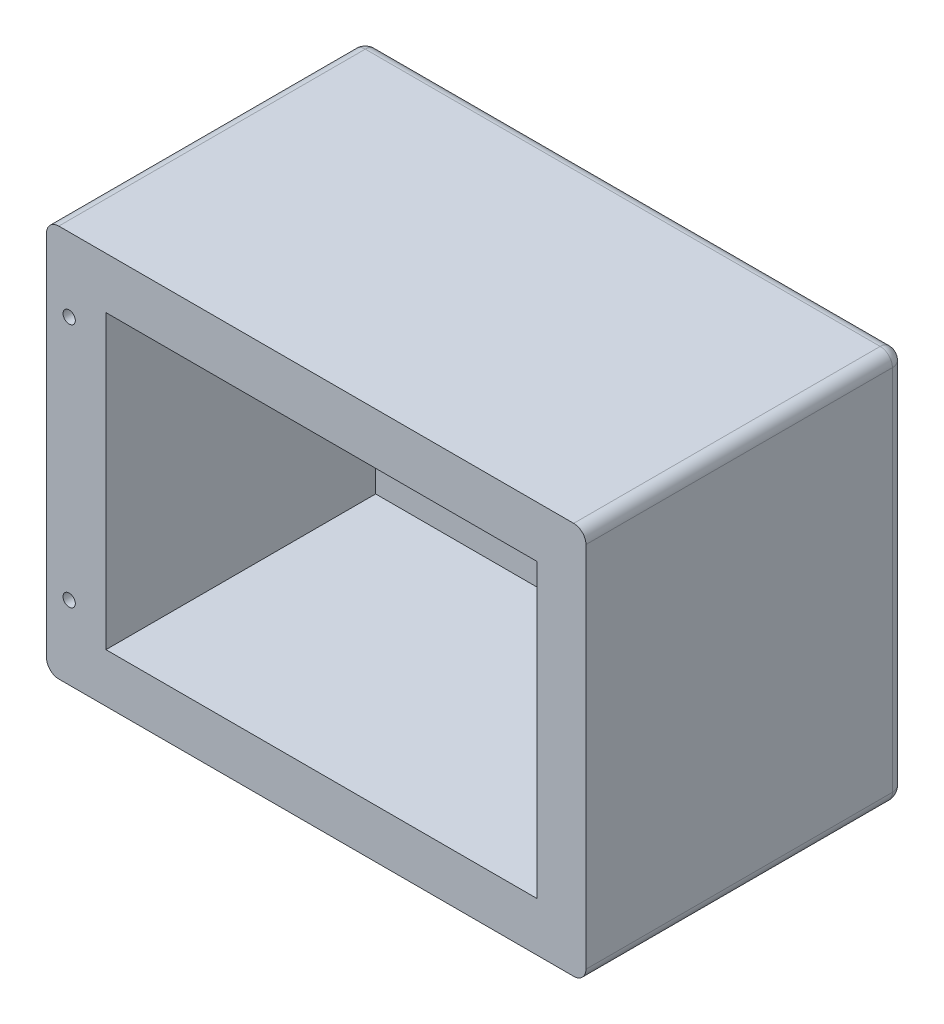
ISO-10303-21;
HEADER;
FILE_DESCRIPTION(('STEP AP214'),'2;1');
FILE_NAME('part.step','',(''),(''),'','','');
FILE_SCHEMA(('AUTOMOTIVE_DESIGN { 1 0 10303 214 1 1 1 1 }'));
ENDSEC;
DATA;
#1=APPLICATION_CONTEXT('core data for automotive mechanical design processes');
#2=APPLICATION_PROTOCOL_DEFINITION('international standard','automotive_design',2000,#1);
#3=PRODUCT_CONTEXT('',#1,'mechanical');
#4=PRODUCT('Part','Part','',(#3));
#5=PRODUCT_RELATED_PRODUCT_CATEGORY('part','',(#4));
#6=PRODUCT_DEFINITION_FORMATION('','',#4);
#7=PRODUCT_DEFINITION_CONTEXT('part definition',#1,'design');
#8=PRODUCT_DEFINITION('design','',#6,#7);
#9=PRODUCT_DEFINITION_SHAPE('','',#8);
#10=(LENGTH_UNIT() NAMED_UNIT(*) SI_UNIT(.MILLI.,.METRE.));
#11=(NAMED_UNIT(*) PLANE_ANGLE_UNIT() SI_UNIT($,.RADIAN.));
#12=(NAMED_UNIT(*) SI_UNIT($,.STERADIAN.) SOLID_ANGLE_UNIT());
#13=UNCERTAINTY_MEASURE_WITH_UNIT(LENGTH_MEASURE(1.E-05),#10,'distance_accuracy_value','');
#14=(GEOMETRIC_REPRESENTATION_CONTEXT(3) GLOBAL_UNCERTAINTY_ASSIGNED_CONTEXT((#13)) GLOBAL_UNIT_ASSIGNED_CONTEXT((#10,
#11,#12)) REPRESENTATION_CONTEXT('',''));
#15=CARTESIAN_POINT('',(0.,0.,0.));
#16=DIRECTION('',(0.,0.,1.));
#17=DIRECTION('',(1.,0.,0.));
#18=AXIS2_PLACEMENT_3D('',#15,#16,#17);
#19=CARTESIAN_POINT('',(0.,-320.,260.));
#20=DIRECTION('',(1.,0.,0.));
#21=DIRECTION('',(0.,1.,0.));
#22=AXIS2_PLACEMENT_3D('',#19,#20,#21);
#23=PLANE('',#22);
#24=DIRECTION('',(0.,-1.,0.));
#25=VECTOR('',#24,1.);
#26=CARTESIAN_POINT('',(0.,-320.,260.));
#27=LINE('',#26,#25);
#28=CARTESIAN_POINT('',(0.,-10.,260.));
#29=VERTEX_POINT('',#28);
#30=CARTESIAN_POINT('',(0.,-310.,260.));
#31=VERTEX_POINT('',#30);
#32=EDGE_CURVE('E196',#29,#31,#27,.T.);
#33=ORIENTED_EDGE('',*,*,#32,.F.);
#34=DIRECTION('',(0.,0.,-1.));
#35=VECTOR('',#34,1.);
#36=CARTESIAN_POINT('',(0.,-10.,260.));
#37=LINE('',#36,#35);
#38=CARTESIAN_POINT('',(0.,-10.,10.));
#39=VERTEX_POINT('',#38);
#40=EDGE_CURVE('E255',#29,#39,#37,.T.);
#41=ORIENTED_EDGE('',*,*,#40,.T.);
#42=DIRECTION('',(0.,-1.,0.));
#43=VECTOR('',#42,1.);
#44=CARTESIAN_POINT('',(0.,-320.,10.));
#45=LINE('',#44,#43);
#46=CARTESIAN_POINT('',(0.,-310.,10.));
#47=VERTEX_POINT('',#46);
#48=EDGE_CURVE('E252',#39,#47,#45,.T.);
#49=ORIENTED_EDGE('',*,*,#48,.T.);
#50=DIRECTION('',(0.,0.,-1.));
#51=VECTOR('',#50,1.);
#52=CARTESIAN_POINT('',(0.,-310.,260.));
#53=LINE('',#52,#51);
#54=EDGE_CURVE('E249',#47,#31,#53,.F.);
#55=ORIENTED_EDGE('',*,*,#54,.T.);
#56=EDGE_LOOP('',(#33,#41,#49,#55));
#57=FACE_BOUND('',#56,.T.);
#58=ADVANCED_FACE('F44',(#57),#23,.F.);
#59=CARTESIAN_POINT('',(440.,-320.,260.));
#60=DIRECTION('',(0.,1.,0.));
#61=DIRECTION('',(-1.,0.,0.));
#62=AXIS2_PLACEMENT_3D('',#59,#60,#61);
#63=PLANE('',#62);
#64=DIRECTION('',(1.,0.,0.));
#65=VECTOR('',#64,1.);
#66=CARTESIAN_POINT('',(440.,-320.,260.));
#67=LINE('',#66,#65);
#68=CARTESIAN_POINT('',(10.,-320.,260.));
#69=VERTEX_POINT('',#68);
#70=CARTESIAN_POINT('',(430.,-320.,260.));
#71=VERTEX_POINT('',#70);
#72=EDGE_CURVE('E205',#69,#71,#67,.T.);
#73=ORIENTED_EDGE('',*,*,#72,.F.);
#74=DIRECTION('',(0.,0.,-1.));
#75=VECTOR('',#74,1.);
#76=CARTESIAN_POINT('',(10.,-320.,260.));
#77=LINE('',#76,#75);
#78=CARTESIAN_POINT('',(10.,-320.,10.));
#79=VERTEX_POINT('',#78);
#80=EDGE_CURVE('E224',#69,#79,#77,.T.);
#81=ORIENTED_EDGE('',*,*,#80,.T.);
#82=DIRECTION('',(1.,0.,0.));
#83=VECTOR('',#82,1.);
#84=CARTESIAN_POINT('',(440.,-320.,10.));
#85=LINE('',#84,#83);
#86=CARTESIAN_POINT('',(430.,-320.,10.));
#87=VERTEX_POINT('',#86);
#88=EDGE_CURVE('E220',#79,#87,#85,.T.);
#89=ORIENTED_EDGE('',*,*,#88,.T.);
#90=DIRECTION('',(0.,0.,-1.));
#91=VECTOR('',#90,1.);
#92=CARTESIAN_POINT('',(430.,-320.,260.));
#93=LINE('',#92,#91);
#94=EDGE_CURVE('E217',#87,#71,#93,.F.);
#95=ORIENTED_EDGE('',*,*,#94,.T.);
#96=EDGE_LOOP('',(#73,#81,#89,#95));
#97=FACE_BOUND('',#96,.T.);
#98=ADVANCED_FACE('F346',(#97),#63,.F.);
#99=CARTESIAN_POINT('',(440.,0.,260.));
#100=DIRECTION('',(-1.,0.,0.));
#101=DIRECTION('',(0.,0.,1.));
#102=AXIS2_PLACEMENT_3D('',#99,#100,#101);
#103=PLANE('',#102);
#104=DIRECTION('',(0.,1.,0.));
#105=VECTOR('',#104,1.);
#106=CARTESIAN_POINT('',(440.,0.,260.));
#107=LINE('',#106,#105);
#108=CARTESIAN_POINT('',(440.,-310.,260.));
#109=VERTEX_POINT('',#108);
#110=CARTESIAN_POINT('',(440.,-10.,260.));
#111=VERTEX_POINT('',#110);
#112=EDGE_CURVE('E209',#109,#111,#107,.T.);
#113=ORIENTED_EDGE('',*,*,#112,.F.);
#114=DIRECTION('',(0.,0.,-1.));
#115=VECTOR('',#114,1.);
#116=CARTESIAN_POINT('',(440.,-310.,260.));
#117=LINE('',#116,#115);
#118=CARTESIAN_POINT('',(440.,-310.,10.));
#119=VERTEX_POINT('',#118);
#120=EDGE_CURVE('E11',#109,#119,#117,.T.);
#121=ORIENTED_EDGE('',*,*,#120,.T.);
#122=DIRECTION('',(0.,1.,0.));
#123=VECTOR('',#122,1.);
#124=CARTESIAN_POINT('',(440.,0.,10.));
#125=LINE('',#124,#123);
#126=CARTESIAN_POINT('',(440.,-10.,10.));
#127=VERTEX_POINT('',#126);
#128=EDGE_CURVE('E54',#119,#127,#125,.T.);
#129=ORIENTED_EDGE('',*,*,#128,.T.);
#130=DIRECTION('',(0.,0.,-1.));
#131=VECTOR('',#130,1.);
#132=CARTESIAN_POINT('',(440.,-10.,260.));
#133=LINE('',#132,#131);
#134=EDGE_CURVE('E270',#127,#111,#133,.F.);
#135=ORIENTED_EDGE('',*,*,#134,.T.);
#136=EDGE_LOOP('',(#113,#121,#129,#135));
#137=FACE_BOUND('',#136,.T.);
#138=ADVANCED_FACE('F353',(#137),#103,.F.);
#139=CARTESIAN_POINT('',(0.,0.,260.));
#140=DIRECTION('',(0.,-1.,0.));
#141=DIRECTION('',(0.,0.,-1.));
#142=AXIS2_PLACEMENT_3D('',#139,#140,#141);
#143=PLANE('',#142);
#144=DIRECTION('',(-1.,0.,0.));
#145=VECTOR('',#144,1.);
#146=CARTESIAN_POINT('',(0.,0.,10.));
#147=LINE('',#146,#145);
#148=CARTESIAN_POINT('',(430.,0.,10.));
#149=VERTEX_POINT('',#148);
#150=CARTESIAN_POINT('',(10.,0.,10.));
#151=VERTEX_POINT('',#150);
#152=EDGE_CURVE('E243',#149,#151,#147,.T.);
#153=ORIENTED_EDGE('',*,*,#152,.T.);
#154=DIRECTION('',(0.,0.,-1.));
#155=VECTOR('',#154,1.);
#156=CARTESIAN_POINT('',(10.,0.,260.));
#157=LINE('',#156,#155);
#158=CARTESIAN_POINT('',(10.,0.,260.));
#159=VERTEX_POINT('',#158);
#160=EDGE_CURVE('E246',#151,#159,#157,.F.);
#161=ORIENTED_EDGE('',*,*,#160,.T.);
#162=DIRECTION('',(-1.,0.,0.));
#163=VECTOR('',#162,1.);
#164=CARTESIAN_POINT('',(0.,0.,260.));
#165=LINE('',#164,#163);
#166=CARTESIAN_POINT('',(430.,0.,260.));
#167=VERTEX_POINT('',#166);
#168=EDGE_CURVE('E213',#167,#159,#165,.T.);
#169=ORIENTED_EDGE('',*,*,#168,.F.);
#170=DIRECTION('',(0.,0.,-1.));
#171=VECTOR('',#170,1.);
#172=CARTESIAN_POINT('',(430.,0.,260.));
#173=LINE('',#172,#171);
#174=EDGE_CURVE('E240',#167,#149,#173,.T.);
#175=ORIENTED_EDGE('',*,*,#174,.T.);
#176=EDGE_LOOP('',(#153,#161,#169,#175));
#177=FACE_BOUND('',#176,.T.);
#178=ADVANCED_FACE('F372',(#177),#143,.F.);
#179=CARTESIAN_POINT('',(0.,0.,260.));
#180=DIRECTION('',(0.,0.,-1.));
#181=DIRECTION('',(-1.,0.,0.));
#182=AXIS2_PLACEMENT_3D('',#179,#180,#181);
#183=PLANE('',#182);
#184=CARTESIAN_POINT('',(18.4707631686556,-60.,260.));
#185=DIRECTION('',(0.,0.,1.));
#186=DIRECTION('',(1.,0.,0.));
#187=AXIS2_PLACEMENT_3D('',#184,#185,#186);
#188=CIRCLE('',#187,5.);
#189=CARTESIAN_POINT('',(23.4707631686556,-60.,260.));
#190=VERTEX_POINT('',#189);
#191=EDGE_CURVE('E615',#190,#190,#188,.T.);
#192=ORIENTED_EDGE('',*,*,#191,.F.);
#193=EDGE_LOOP('',(#192));
#194=FACE_BOUND('',#193,.T.);
#195=CARTESIAN_POINT('',(18.4707631686556,-260.,260.));
#196=DIRECTION('',(0.,0.,1.));
#197=DIRECTION('',(1.,0.,0.));
#198=AXIS2_PLACEMENT_3D('',#195,#196,#197);
#199=CIRCLE('',#198,5.);
#200=CARTESIAN_POINT('',(23.4707631686556,-260.,260.));
#201=VERTEX_POINT('',#200);
#202=EDGE_CURVE('E619',#201,#201,#199,.T.);
#203=ORIENTED_EDGE('',*,*,#202,.F.);
#204=EDGE_LOOP('',(#203));
#205=FACE_BOUND('',#204,.T.);
#206=DIRECTION('',(1.,0.,0.));
#207=VECTOR('',#206,1.);
#208=CARTESIAN_POINT('',(48.4707631686556,-280.,260.));
#209=LINE('',#208,#207);
#210=CARTESIAN_POINT('',(48.4707631686556,-280.,260.));
#211=VERTEX_POINT('',#210);
#212=CARTESIAN_POINT('',(400.,-280.,260.));
#213=VERTEX_POINT('',#212);
#214=EDGE_CURVE('E187',#211,#213,#209,.T.);
#215=ORIENTED_EDGE('',*,*,#214,.F.);
#216=DIRECTION('',(0.,-1.,0.));
#217=VECTOR('',#216,1.);
#218=CARTESIAN_POINT('',(48.4707631686556,-41.8672911787667,260.));
#219=LINE('',#218,#217);
#220=CARTESIAN_POINT('',(48.4707631686556,-41.8672911787667,260.));
#221=VERTEX_POINT('',#220);
#222=EDGE_CURVE('E151',#221,#211,#219,.T.);
#223=ORIENTED_EDGE('',*,*,#222,.F.);
#224=DIRECTION('',(-1.,0.,0.));
#225=VECTOR('',#224,1.);
#226=CARTESIAN_POINT('',(48.4707631686556,-41.8672911787667,260.));
#227=LINE('',#226,#225);
#228=CARTESIAN_POINT('',(400.,-41.8672911787667,260.));
#229=VERTEX_POINT('',#228);
#230=EDGE_CURVE('E171',#229,#221,#227,.T.);
#231=ORIENTED_EDGE('',*,*,#230,.F.);
#232=DIRECTION('',(0.,1.,0.));
#233=VECTOR('',#232,1.);
#234=CARTESIAN_POINT('',(400.,-41.8672911787667,260.));
#235=LINE('',#234,#233);
#236=EDGE_CURVE('E175',#213,#229,#235,.T.);
#237=ORIENTED_EDGE('',*,*,#236,.F.);
#238=EDGE_LOOP('',(#215,#223,#231,#237));
#239=FACE_BOUND('',#238,.T.);
#240=ORIENTED_EDGE('',*,*,#168,.T.);
#241=CARTESIAN_POINT('',(10.,-10.,260.));
#242=DIRECTION('',(0.,0.,-1.));
#243=DIRECTION('',(-1.,0.,0.));
#244=AXIS2_PLACEMENT_3D('',#241,#242,#243);
#245=CIRCLE('',#244,10.);
#246=EDGE_CURVE('E267',#159,#29,#245,.F.);
#247=ORIENTED_EDGE('',*,*,#246,.T.);
#248=ORIENTED_EDGE('',*,*,#32,.T.);
#249=CARTESIAN_POINT('',(10.,-310.,260.));
#250=DIRECTION('',(0.,0.,-1.));
#251=DIRECTION('',(-1.,0.,0.));
#252=AXIS2_PLACEMENT_3D('',#249,#250,#251);
#253=CIRCLE('',#252,10.);
#254=EDGE_CURVE('E264',#31,#69,#253,.F.);
#255=ORIENTED_EDGE('',*,*,#254,.T.);
#256=ORIENTED_EDGE('',*,*,#72,.T.);
#257=CARTESIAN_POINT('',(430.,-310.,260.));
#258=DIRECTION('',(0.,0.,-1.));
#259=DIRECTION('',(-1.,0.,0.));
#260=AXIS2_PLACEMENT_3D('',#257,#258,#259);
#261=CIRCLE('',#260,10.);
#262=EDGE_CURVE('E261',#71,#109,#261,.F.);
#263=ORIENTED_EDGE('',*,*,#262,.T.);
#264=ORIENTED_EDGE('',*,*,#112,.T.);
#265=CARTESIAN_POINT('',(430.,-10.,260.));
#266=DIRECTION('',(0.,0.,-1.));
#267=DIRECTION('',(-1.,0.,0.));
#268=AXIS2_PLACEMENT_3D('',#265,#266,#267);
#269=CIRCLE('',#268,10.);
#270=EDGE_CURVE('E258',#111,#167,#269,.F.);
#271=ORIENTED_EDGE('',*,*,#270,.T.);
#272=EDGE_LOOP('',(#240,#247,#248,#255,#256,#263,#264,#271));
#273=FACE_BOUND('',#272,.T.);
#274=ADVANCED_FACE('F343',(#194,#205,#239,#273),#183,.F.);
#275=CARTESIAN_POINT('',(0.,0.,0.));
#276=DIRECTION('',(0.,0.,-1.));
#277=DIRECTION('',(-1.,0.,0.));
#278=AXIS2_PLACEMENT_3D('',#275,#276,#277);
#279=PLANE('',#278);
#280=DIRECTION('',(1.,0.,0.));
#281=VECTOR('',#280,1.);
#282=CARTESIAN_POINT('',(0.,-310.,0.));
#283=LINE('',#282,#281);
#284=CARTESIAN_POINT('',(430.,-310.,0.));
#285=VERTEX_POINT('',#284);
#286=CARTESIAN_POINT('',(10.,-310.,0.));
#287=VERTEX_POINT('',#286);
#288=EDGE_CURVE('E233',#285,#287,#283,.F.);
#289=ORIENTED_EDGE('',*,*,#288,.T.);
#290=DIRECTION('',(0.,-1.,0.));
#291=VECTOR('',#290,1.);
#292=CARTESIAN_POINT('',(10.,0.,0.));
#293=LINE('',#292,#291);
#294=CARTESIAN_POINT('',(10.,-10.,0.));
#295=VERTEX_POINT('',#294);
#296=EDGE_CURVE('E237',#287,#295,#293,.F.);
#297=ORIENTED_EDGE('',*,*,#296,.T.);
#298=DIRECTION('',(-1.,0.,0.));
#299=VECTOR('',#298,1.);
#300=CARTESIAN_POINT('',(440.,-10.,0.));
#301=LINE('',#300,#299);
#302=CARTESIAN_POINT('',(430.,-10.,0.));
#303=VERTEX_POINT('',#302);
#304=EDGE_CURVE('E230',#295,#303,#301,.F.);
#305=ORIENTED_EDGE('',*,*,#304,.T.);
#306=DIRECTION('',(0.,1.,0.));
#307=VECTOR('',#306,1.);
#308=CARTESIAN_POINT('',(430.,-320.,0.));
#309=LINE('',#308,#307);
#310=EDGE_CURVE('E227',#303,#285,#309,.F.);
#311=ORIENTED_EDGE('',*,*,#310,.T.);
#312=EDGE_LOOP('',(#289,#297,#305,#311));
#313=FACE_BOUND('',#312,.T.);
#314=ADVANCED_FACE('F368',(#313),#279,.T.);
#315=CARTESIAN_POINT('',(48.4707631686556,-41.8672911787667,40.));
#316=DIRECTION('',(-1.,0.,0.));
#317=DIRECTION('',(0.,-1.,0.));
#318=AXIS2_PLACEMENT_3D('',#315,#316,#317);
#319=PLANE('',#318);
#320=ORIENTED_EDGE('',*,*,#222,.T.);
#321=DIRECTION('',(0.,0.,1.));
#322=VECTOR('',#321,1.);
#323=CARTESIAN_POINT('',(48.4707631686556,-280.,40.));
#324=LINE('',#323,#322);
#325=CARTESIAN_POINT('',(48.4707631686556,-280.,40.));
#326=VERTEX_POINT('',#325);
#327=EDGE_CURVE('E144',#326,#211,#324,.T.);
#328=ORIENTED_EDGE('',*,*,#327,.F.);
#329=DIRECTION('',(0.,-1.,0.));
#330=VECTOR('',#329,1.);
#331=CARTESIAN_POINT('',(48.4707631686556,-41.8672911787667,40.));
#332=LINE('',#331,#330);
#333=CARTESIAN_POINT('',(48.4707631686556,-41.8672911787667,40.));
#334=VERTEX_POINT('',#333);
#335=EDGE_CURVE('E148',#334,#326,#332,.T.);
#336=ORIENTED_EDGE('',*,*,#335,.F.);
#337=DIRECTION('',(0.,0.,1.));
#338=VECTOR('',#337,1.);
#339=CARTESIAN_POINT('',(48.4707631686556,-41.8672911787667,40.));
#340=LINE('',#339,#338);
#341=EDGE_CURVE('E193',#334,#221,#340,.T.);
#342=ORIENTED_EDGE('',*,*,#341,.T.);
#343=EDGE_LOOP('',(#320,#328,#336,#342));
#344=FACE_BOUND('',#343,.T.);
#345=ADVANCED_FACE('F146',(#344),#319,.F.);
#346=CARTESIAN_POINT('',(48.4707631686556,-41.8672911787667,40.));
#347=DIRECTION('',(0.,1.,0.));
#348=DIRECTION('',(0.,0.,1.));
#349=AXIS2_PLACEMENT_3D('',#346,#347,#348);
#350=PLANE('',#349);
#351=ORIENTED_EDGE('',*,*,#230,.T.);
#352=ORIENTED_EDGE('',*,*,#341,.F.);
#353=DIRECTION('',(-1.,0.,0.));
#354=VECTOR('',#353,1.);
#355=CARTESIAN_POINT('',(48.4707631686556,-41.8672911787667,40.));
#356=LINE('',#355,#354);
#357=CARTESIAN_POINT('',(400.,-41.8672911787667,40.));
#358=VERTEX_POINT('',#357);
#359=EDGE_CURVE('E157',#358,#334,#356,.T.);
#360=ORIENTED_EDGE('',*,*,#359,.F.);
#361=DIRECTION('',(0.,0.,1.));
#362=VECTOR('',#361,1.);
#363=CARTESIAN_POINT('',(400.,-41.8672911787667,40.));
#364=LINE('',#363,#362);
#365=EDGE_CURVE('E197',#358,#229,#364,.T.);
#366=ORIENTED_EDGE('',*,*,#365,.T.);
#367=EDGE_LOOP('',(#351,#352,#360,#366));
#368=FACE_BOUND('',#367,.T.);
#369=ADVANCED_FACE('F554',(#368),#350,.F.);
#370=CARTESIAN_POINT('',(400.,-41.8672911787667,40.));
#371=DIRECTION('',(1.,0.,0.));
#372=DIRECTION('',(0.,1.,0.));
#373=AXIS2_PLACEMENT_3D('',#370,#371,#372);
#374=PLANE('',#373);
#375=ORIENTED_EDGE('',*,*,#236,.T.);
#376=ORIENTED_EDGE('',*,*,#365,.F.);
#377=DIRECTION('',(0.,1.,0.));
#378=VECTOR('',#377,1.);
#379=CARTESIAN_POINT('',(400.,-41.8672911787667,40.));
#380=LINE('',#379,#378);
#381=CARTESIAN_POINT('',(400.,-280.,40.));
#382=VERTEX_POINT('',#381);
#383=EDGE_CURVE('E166',#382,#358,#380,.T.);
#384=ORIENTED_EDGE('',*,*,#383,.F.);
#385=DIRECTION('',(0.,0.,1.));
#386=VECTOR('',#385,1.);
#387=CARTESIAN_POINT('',(400.,-280.,40.));
#388=LINE('',#387,#386);
#389=EDGE_CURVE('E156',#382,#213,#388,.T.);
#390=ORIENTED_EDGE('',*,*,#389,.T.);
#391=EDGE_LOOP('',(#375,#376,#384,#390));
#392=FACE_BOUND('',#391,.T.);
#393=ADVANCED_FACE('F546',(#392),#374,.F.);
#394=CARTESIAN_POINT('',(48.4707631686556,-280.,40.));
#395=DIRECTION('',(0.,-1.,0.));
#396=DIRECTION('',(0.,0.,-1.));
#397=AXIS2_PLACEMENT_3D('',#394,#395,#396);
#398=PLANE('',#397);
#399=ORIENTED_EDGE('',*,*,#214,.T.);
#400=ORIENTED_EDGE('',*,*,#389,.F.);
#401=DIRECTION('',(1.,0.,0.));
#402=VECTOR('',#401,1.);
#403=CARTESIAN_POINT('',(48.4707631686556,-280.,40.));
#404=LINE('',#403,#402);
#405=EDGE_CURVE('E160',#326,#382,#404,.T.);
#406=ORIENTED_EDGE('',*,*,#405,.F.);
#407=ORIENTED_EDGE('',*,*,#327,.T.);
#408=EDGE_LOOP('',(#399,#400,#406,#407));
#409=FACE_BOUND('',#408,.T.);
#410=ADVANCED_FACE('F161',(#409),#398,.F.);
#411=CARTESIAN_POINT('',(0.,0.,40.));
#412=DIRECTION('',(0.,0.,1.));
#413=DIRECTION('',(1.,0.,0.));
#414=AXIS2_PLACEMENT_3D('',#411,#412,#413);
#415=PLANE('',#414);
#416=ORIENTED_EDGE('',*,*,#335,.T.);
#417=ORIENTED_EDGE('',*,*,#405,.T.);
#418=ORIENTED_EDGE('',*,*,#383,.T.);
#419=ORIENTED_EDGE('',*,*,#359,.T.);
#420=EDGE_LOOP('',(#416,#417,#418,#419));
#421=FACE_BOUND('',#420,.T.);
#422=ADVANCED_FACE('F168',(#421),#415,.T.);
#423=CARTESIAN_POINT('',(10.,-10.,260.));
#424=DIRECTION('',(0.,0.,-1.));
#425=DIRECTION('',(-1.,0.,0.));
#426=AXIS2_PLACEMENT_3D('',#423,#424,#425);
#427=CYLINDRICAL_SURFACE('',#426,10.);
#428=ORIENTED_EDGE('',*,*,#246,.F.);
#429=ORIENTED_EDGE('',*,*,#160,.F.);
#430=CARTESIAN_POINT('',(10.,-10.,10.));
#431=DIRECTION('',(0.,0.,-1.));
#432=DIRECTION('',(-1.,0.,0.));
#433=AXIS2_PLACEMENT_3D('',#430,#431,#432);
#434=CIRCLE('',#433,10.);
#435=EDGE_CURVE('E313',#39,#151,#434,.T.);
#436=ORIENTED_EDGE('',*,*,#435,.F.);
#437=ORIENTED_EDGE('',*,*,#40,.F.);
#438=EDGE_LOOP('',(#428,#429,#436,#437));
#439=FACE_BOUND('',#438,.T.);
#440=ADVANCED_FACE('F46',(#439),#427,.T.);
#441=CARTESIAN_POINT('',(430.,-10.,260.));
#442=DIRECTION('',(0.,0.,-1.));
#443=DIRECTION('',(-1.,0.,0.));
#444=AXIS2_PLACEMENT_3D('',#441,#442,#443);
#445=CYLINDRICAL_SURFACE('',#444,10.);
#446=ORIENTED_EDGE('',*,*,#270,.F.);
#447=ORIENTED_EDGE('',*,*,#134,.F.);
#448=CARTESIAN_POINT('',(430.,-10.,10.));
#449=DIRECTION('',(0.,0.,-1.));
#450=DIRECTION('',(-1.,0.,0.));
#451=AXIS2_PLACEMENT_3D('',#448,#449,#450);
#452=CIRCLE('',#451,10.);
#453=EDGE_CURVE('E310',#149,#127,#452,.T.);
#454=ORIENTED_EDGE('',*,*,#453,.F.);
#455=ORIENTED_EDGE('',*,*,#174,.F.);
#456=EDGE_LOOP('',(#446,#447,#454,#455));
#457=FACE_BOUND('',#456,.T.);
#458=ADVANCED_FACE('F356',(#457),#445,.T.);
#459=CARTESIAN_POINT('',(0.,-10.,10.));
#460=DIRECTION('',(1.,0.,0.));
#461=DIRECTION('',(0.,0.,-1.));
#462=AXIS2_PLACEMENT_3D('',#459,#460,#461);
#463=CYLINDRICAL_SURFACE('',#462,10.);
#464=CARTESIAN_POINT('',(10.,-10.,10.));
#465=DIRECTION('',(-1.,0.,0.));
#466=DIRECTION('',(0.,0.,1.));
#467=AXIS2_PLACEMENT_3D('',#464,#465,#466);
#468=CIRCLE('',#467,10.);
#469=EDGE_CURVE('E48',#151,#295,#468,.T.);
#470=ORIENTED_EDGE('',*,*,#469,.F.);
#471=ORIENTED_EDGE('',*,*,#152,.F.);
#472=CARTESIAN_POINT('',(430.,-10.,10.));
#473=DIRECTION('',(1.,0.,0.));
#474=DIRECTION('',(0.,0.,-1.));
#475=AXIS2_PLACEMENT_3D('',#472,#473,#474);
#476=CIRCLE('',#475,10.);
#477=EDGE_CURVE('E306',#303,#149,#476,.T.);
#478=ORIENTED_EDGE('',*,*,#477,.F.);
#479=ORIENTED_EDGE('',*,*,#304,.F.);
#480=EDGE_LOOP('',(#470,#471,#478,#479));
#481=FACE_BOUND('',#480,.T.);
#482=ADVANCED_FACE('F369',(#481),#463,.T.);
#483=CARTESIAN_POINT('',(10.,-10.,10.));
#484=DIRECTION('',(0.,1.,0.));
#485=DIRECTION('',(0.,0.,1.));
#486=AXIS2_PLACEMENT_3D('',#483,#484,#485);
#487=SPHERICAL_SURFACE('',#486,10.);
#488=ORIENTED_EDGE('',*,*,#435,.T.);
#489=ORIENTED_EDGE('',*,*,#469,.T.);
#490=CARTESIAN_POINT('',(10.,-10.,10.));
#491=DIRECTION('',(0.,1.,0.));
#492=DIRECTION('',(-1.,0.,0.));
#493=AXIS2_PLACEMENT_3D('',#490,#491,#492);
#494=CIRCLE('',#493,10.);
#495=EDGE_CURVE('E302',#39,#295,#494,.F.);
#496=ORIENTED_EDGE('',*,*,#495,.F.);
#497=EDGE_LOOP('',(#488,#489,#496));
#498=FACE_BOUND('',#497,.T.);
#499=ADVANCED_FACE('F322',(#498),#487,.T.);
#500=CARTESIAN_POINT('',(430.,-10.,10.));
#501=DIRECTION('',(0.,1.,0.));
#502=DIRECTION('',(0.,0.,1.));
#503=AXIS2_PLACEMENT_3D('',#500,#501,#502);
#504=SPHERICAL_SURFACE('',#503,10.);
#505=ORIENTED_EDGE('',*,*,#477,.T.);
#506=ORIENTED_EDGE('',*,*,#453,.T.);
#507=CARTESIAN_POINT('',(430.,-10.,10.));
#508=DIRECTION('',(0.,1.,0.));
#509=DIRECTION('',(0.,0.,1.));
#510=AXIS2_PLACEMENT_3D('',#507,#508,#509);
#511=CIRCLE('',#510,10.);
#512=EDGE_CURVE('E298',#303,#127,#511,.F.);
#513=ORIENTED_EDGE('',*,*,#512,.F.);
#514=EDGE_LOOP('',(#505,#506,#513));
#515=FACE_BOUND('',#514,.T.);
#516=ADVANCED_FACE('F360',(#515),#504,.T.);
#517=CARTESIAN_POINT('',(10.,-320.,10.));
#518=DIRECTION('',(0.,1.,0.));
#519=DIRECTION('',(-1.,0.,0.));
#520=AXIS2_PLACEMENT_3D('',#517,#518,#519);
#521=CYLINDRICAL_SURFACE('',#520,10.);
#522=ORIENTED_EDGE('',*,*,#495,.T.);
#523=ORIENTED_EDGE('',*,*,#296,.F.);
#524=CARTESIAN_POINT('',(10.,-310.,10.));
#525=DIRECTION('',(0.,-1.,0.));
#526=DIRECTION('',(0.,0.,-1.));
#527=AXIS2_PLACEMENT_3D('',#524,#525,#526);
#528=CIRCLE('',#527,10.);
#529=EDGE_CURVE('E294',#47,#287,#528,.T.);
#530=ORIENTED_EDGE('',*,*,#529,.F.);
#531=ORIENTED_EDGE('',*,*,#48,.F.);
#532=EDGE_LOOP('',(#522,#523,#530,#531));
#533=FACE_BOUND('',#532,.T.);
#534=ADVANCED_FACE('F329',(#533),#521,.T.);
#535=CARTESIAN_POINT('',(10.,-310.,260.));
#536=DIRECTION('',(0.,0.,-1.));
#537=DIRECTION('',(-1.,0.,0.));
#538=AXIS2_PLACEMENT_3D('',#535,#536,#537);
#539=CYLINDRICAL_SURFACE('',#538,10.);
#540=ORIENTED_EDGE('',*,*,#254,.F.);
#541=ORIENTED_EDGE('',*,*,#54,.F.);
#542=CARTESIAN_POINT('',(10.,-310.,10.));
#543=DIRECTION('',(0.,0.,-1.));
#544=DIRECTION('',(-1.,0.,0.));
#545=AXIS2_PLACEMENT_3D('',#542,#543,#544);
#546=CIRCLE('',#545,10.);
#547=EDGE_CURVE('E290',#79,#47,#546,.T.);
#548=ORIENTED_EDGE('',*,*,#547,.F.);
#549=ORIENTED_EDGE('',*,*,#80,.F.);
#550=EDGE_LOOP('',(#540,#541,#548,#549));
#551=FACE_BOUND('',#550,.T.);
#552=ADVANCED_FACE('F338',(#551),#539,.T.);
#553=CARTESIAN_POINT('',(430.,-310.,260.));
#554=DIRECTION('',(0.,0.,-1.));
#555=DIRECTION('',(-1.,0.,0.));
#556=AXIS2_PLACEMENT_3D('',#553,#554,#555);
#557=CYLINDRICAL_SURFACE('',#556,10.);
#558=ORIENTED_EDGE('',*,*,#262,.F.);
#559=ORIENTED_EDGE('',*,*,#94,.F.);
#560=CARTESIAN_POINT('',(430.,-310.,10.));
#561=DIRECTION('',(0.,0.,-1.));
#562=DIRECTION('',(-1.,0.,0.));
#563=AXIS2_PLACEMENT_3D('',#560,#561,#562);
#564=CIRCLE('',#563,10.);
#565=EDGE_CURVE('E286',#119,#87,#564,.T.);
#566=ORIENTED_EDGE('',*,*,#565,.F.);
#567=ORIENTED_EDGE('',*,*,#120,.F.);
#568=EDGE_LOOP('',(#558,#559,#566,#567));
#569=FACE_BOUND('',#568,.T.);
#570=ADVANCED_FACE('F351',(#569),#557,.T.);
#571=CARTESIAN_POINT('',(430.,0.,10.));
#572=DIRECTION('',(0.,-1.,0.));
#573=DIRECTION('',(0.,0.,-1.));
#574=AXIS2_PLACEMENT_3D('',#571,#572,#573);
#575=CYLINDRICAL_SURFACE('',#574,10.);
#576=ORIENTED_EDGE('',*,*,#512,.T.);
#577=ORIENTED_EDGE('',*,*,#128,.F.);
#578=CARTESIAN_POINT('',(430.,-310.,10.));
#579=DIRECTION('',(0.,-1.,0.));
#580=DIRECTION('',(0.,0.,-1.));
#581=AXIS2_PLACEMENT_3D('',#578,#579,#580);
#582=CIRCLE('',#581,10.);
#583=EDGE_CURVE('E282',#285,#119,#582,.T.);
#584=ORIENTED_EDGE('',*,*,#583,.F.);
#585=ORIENTED_EDGE('',*,*,#310,.F.);
#586=EDGE_LOOP('',(#576,#577,#584,#585));
#587=FACE_BOUND('',#586,.T.);
#588=ADVANCED_FACE('F364',(#587),#575,.T.);
#589=CARTESIAN_POINT('',(10.,-310.,10.));
#590=DIRECTION('',(-1.,0.,0.));
#591=DIRECTION('',(0.,0.,1.));
#592=AXIS2_PLACEMENT_3D('',#589,#590,#591);
#593=SPHERICAL_SURFACE('',#592,10.);
#594=ORIENTED_EDGE('',*,*,#547,.T.);
#595=ORIENTED_EDGE('',*,*,#529,.T.);
#596=CARTESIAN_POINT('',(10.,-310.,10.));
#597=DIRECTION('',(-1.,0.,0.));
#598=DIRECTION('',(0.,-1.,0.));
#599=AXIS2_PLACEMENT_3D('',#596,#597,#598);
#600=CIRCLE('',#599,10.);
#601=EDGE_CURVE('E278',#79,#287,#600,.F.);
#602=ORIENTED_EDGE('',*,*,#601,.F.);
#603=EDGE_LOOP('',(#594,#595,#602));
#604=FACE_BOUND('',#603,.T.);
#605=ADVANCED_FACE('F399',(#604),#593,.T.);
#606=CARTESIAN_POINT('',(430.,-310.,10.));
#607=DIRECTION('',(1.,0.,0.));
#608=DIRECTION('',(0.,0.,-1.));
#609=AXIS2_PLACEMENT_3D('',#606,#607,#608);
#610=SPHERICAL_SURFACE('',#609,10.);
#611=ORIENTED_EDGE('',*,*,#583,.T.);
#612=ORIENTED_EDGE('',*,*,#565,.T.);
#613=CARTESIAN_POINT('',(430.,-310.,10.));
#614=DIRECTION('',(1.,0.,0.));
#615=DIRECTION('',(0.,0.,-1.));
#616=AXIS2_PLACEMENT_3D('',#613,#614,#615);
#617=CIRCLE('',#616,10.);
#618=EDGE_CURVE('E275',#285,#87,#617,.F.);
#619=ORIENTED_EDGE('',*,*,#618,.F.);
#620=EDGE_LOOP('',(#611,#612,#619));
#621=FACE_BOUND('',#620,.T.);
#622=ADVANCED_FACE('F395',(#621),#610,.T.);
#623=CARTESIAN_POINT('',(440.,-310.,10.));
#624=DIRECTION('',(-1.,0.,0.));
#625=DIRECTION('',(0.,-1.,0.));
#626=AXIS2_PLACEMENT_3D('',#623,#624,#625);
#627=CYLINDRICAL_SURFACE('',#626,10.);
#628=ORIENTED_EDGE('',*,*,#601,.T.);
#629=ORIENTED_EDGE('',*,*,#288,.F.);
#630=ORIENTED_EDGE('',*,*,#618,.T.);
#631=ORIENTED_EDGE('',*,*,#88,.F.);
#632=EDGE_LOOP('',(#628,#629,#630,#631));
#633=FACE_BOUND('',#632,.T.);
#634=ADVANCED_FACE('F391',(#633),#627,.T.);
#635=CARTESIAN_POINT('',(18.4707631686556,-260.,250.));
#636=DIRECTION('',(0.,0.,1.));
#637=DIRECTION('',(1.,0.,0.));
#638=AXIS2_PLACEMENT_3D('',#635,#636,#637);
#639=CYLINDRICAL_SURFACE('',#638,5.);
#640=CARTESIAN_POINT('',(18.4707631686556,-260.,250.));
#641=DIRECTION('',(0.,0.,1.));
#642=DIRECTION('',(1.,0.,0.));
#643=AXIS2_PLACEMENT_3D('',#640,#641,#642);
#644=CIRCLE('',#643,5.);
#645=CARTESIAN_POINT('',(23.4707631686556,-260.,250.));
#646=VERTEX_POINT('',#645);
#647=EDGE_CURVE('E178',#646,#646,#644,.T.);
#648=ORIENTED_EDGE('',*,*,#647,.F.);
#649=EDGE_LOOP('',(#648));
#650=FACE_BOUND('',#649,.T.);
#651=ORIENTED_EDGE('',*,*,#202,.T.);
#652=EDGE_LOOP('',(#651));
#653=FACE_BOUND('',#652,.T.);
#654=ADVANCED_FACE('F394',(#650,#653),#639,.F.);
#655=CARTESIAN_POINT('',(18.4707631686556,-260.,250.));
#656=DIRECTION('',(0.,0.,1.));
#657=DIRECTION('',(1.,0.,0.));
#658=AXIS2_PLACEMENT_3D('',#655,#656,#657);
#659=PLANE('',#658);
#660=ORIENTED_EDGE('',*,*,#647,.T.);
#661=EDGE_LOOP('',(#660));
#662=FACE_BOUND('',#661,.T.);
#663=ADVANCED_FACE('F483',(#662),#659,.T.);
#664=CARTESIAN_POINT('',(18.4707631686556,-60.,250.));
#665=DIRECTION('',(0.,0.,1.));
#666=DIRECTION('',(1.,0.,0.));
#667=AXIS2_PLACEMENT_3D('',#664,#665,#666);
#668=CYLINDRICAL_SURFACE('',#667,5.);
#669=CARTESIAN_POINT('',(18.4707631686556,-60.,250.));
#670=DIRECTION('',(0.,0.,1.));
#671=DIRECTION('',(1.,0.,0.));
#672=AXIS2_PLACEMENT_3D('',#669,#670,#671);
#673=CIRCLE('',#672,5.);
#674=CARTESIAN_POINT('',(23.4707631686556,-60.,250.));
#675=VERTEX_POINT('',#674);
#676=EDGE_CURVE('E279',#675,#675,#673,.T.);
#677=ORIENTED_EDGE('',*,*,#676,.F.);
#678=EDGE_LOOP('',(#677));
#679=FACE_BOUND('',#678,.T.);
#680=ORIENTED_EDGE('',*,*,#191,.T.);
#681=EDGE_LOOP('',(#680));
#682=FACE_BOUND('',#681,.T.);
#683=ADVANCED_FACE('F492',(#679,#682),#668,.F.);
#684=CARTESIAN_POINT('',(18.4707631686556,-60.,250.));
#685=DIRECTION('',(0.,0.,1.));
#686=DIRECTION('',(1.,0.,0.));
#687=AXIS2_PLACEMENT_3D('',#684,#685,#686);
#688=PLANE('',#687);
#689=ORIENTED_EDGE('',*,*,#676,.T.);
#690=EDGE_LOOP('',(#689));
#691=FACE_BOUND('',#690,.T.);
#692=ADVANCED_FACE('F501',(#691),#688,.T.);
#693=CLOSED_SHELL('',(#58,#98,#138,#178,#274,#314,#345,#369,#393,#410,#422,#440,#458,#482,#499,
#516,#534,#552,#570,#588,#605,#622,#634,#654,#663,#683,#692));
#694=MANIFOLD_SOLID_BREP('B2',#693);
#695=ADVANCED_BREP_SHAPE_REPRESENTATION('',(#18,#694),#14);
#696=SHAPE_DEFINITION_REPRESENTATION(#9,#695);
ENDSEC;
END-ISO-10303-21;
